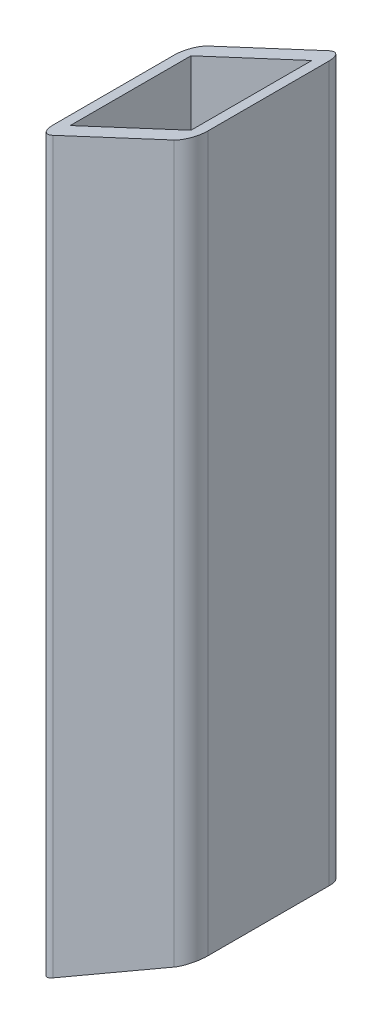
ISO-10303-21;
HEADER;
FILE_DESCRIPTION(('STEP AP214'),'2;1');
FILE_NAME('part.step','',(''),(''),'','','');
FILE_SCHEMA(('AUTOMOTIVE_DESIGN { 1 0 10303 214 1 1 1 1 }'));
ENDSEC;
DATA;
#1=APPLICATION_CONTEXT('core data for automotive mechanical design processes');
#2=APPLICATION_PROTOCOL_DEFINITION('international standard','automotive_design',2000,#1);
#3=PRODUCT_CONTEXT('',#1,'mechanical');
#4=PRODUCT('Part','Part','',(#3));
#5=PRODUCT_RELATED_PRODUCT_CATEGORY('part','',(#4));
#6=PRODUCT_DEFINITION_FORMATION('','',#4);
#7=PRODUCT_DEFINITION_CONTEXT('part definition',#1,'design');
#8=PRODUCT_DEFINITION('design','',#6,#7);
#9=PRODUCT_DEFINITION_SHAPE('','',#8);
#10=(LENGTH_UNIT() NAMED_UNIT(*) SI_UNIT(.MILLI.,.METRE.));
#11=(NAMED_UNIT(*) PLANE_ANGLE_UNIT() SI_UNIT($,.RADIAN.));
#12=(NAMED_UNIT(*) SI_UNIT($,.STERADIAN.) SOLID_ANGLE_UNIT());
#13=UNCERTAINTY_MEASURE_WITH_UNIT(LENGTH_MEASURE(1.E-05),#10,'distance_accuracy_value','');
#14=(GEOMETRIC_REPRESENTATION_CONTEXT(3) GLOBAL_UNCERTAINTY_ASSIGNED_CONTEXT((#13)) GLOBAL_UNIT_ASSIGNED_CONTEXT((#10,
#11,#12)) REPRESENTATION_CONTEXT('',''));
#15=CARTESIAN_POINT('',(0.,0.,0.));
#16=DIRECTION('',(0.,0.,1.));
#17=DIRECTION('',(1.,0.,0.));
#18=AXIS2_PLACEMENT_3D('',#15,#16,#17);
#19=CARTESIAN_POINT('',(22.8,133.,2.8));
#20=DIRECTION('',(0.,-1.,0.));
#21=DIRECTION('',(0.,0.,-1.));
#22=AXIS2_PLACEMENT_3D('',#19,#20,#21);
#23=CYLINDRICAL_SURFACE('',#22,2.8);
#24=CARTESIAN_POINT('',(22.8,13.1635861375233,2.8));
#25=DIRECTION('',(0.499999999999995,-0.866025403784442,0.));
#26=DIRECTION('',(-0.866025403784442,-0.499999999999995,0.));
#27=AXIS2_PLACEMENT_3D('',#24,#25,#26);
#28=ELLIPSE('',#27,3.23316150746189,2.8);
#29=CARTESIAN_POINT('',(22.8,13.1635861375233,0.));
#30=VERTEX_POINT('',#29);
#31=CARTESIAN_POINT('',(25.6,14.7801668912542,2.80000000000002));
#32=VERTEX_POINT('',#31);
#33=EDGE_CURVE('E172',#30,#32,#28,.T.);
#34=ORIENTED_EDGE('',*,*,#33,.F.);
#35=DIRECTION('',(0.,-1.,0.));
#36=VECTOR('',#35,1.);
#37=CARTESIAN_POINT('',(22.8,133.,0.));
#38=LINE('',#37,#36);
#39=CARTESIAN_POINT('',(22.8,131.694338557166,0.));
#40=VERTEX_POINT('',#39);
#41=EDGE_CURVE('E43',#40,#30,#38,.T.);
#42=ORIENTED_EDGE('',*,*,#41,.F.);
#43=CARTESIAN_POINT('',(22.8,131.694338557166,2.8));
#44=DIRECTION('',(-0.422618261740701,0.906307787036649,0.));
#45=DIRECTION('',(-0.906307787036649,-0.422618261740701,0.));
#46=AXIS2_PLACEMENT_3D('',#43,#44,#45);
#47=ELLIPSE('',#46,3.08945817309498,2.8);
#48=CARTESIAN_POINT('',(25.6,133.,2.8));
#49=VERTEX_POINT('',#48);
#50=EDGE_CURVE('E170',#49,#40,#47,.T.);
#51=ORIENTED_EDGE('',*,*,#50,.F.);
#52=DIRECTION('',(0.,-1.,0.));
#53=VECTOR('',#52,1.);
#54=CARTESIAN_POINT('',(25.6,133.,2.80000000000002));
#55=LINE('',#54,#53);
#56=EDGE_CURVE('E189',#49,#32,#55,.T.);
#57=ORIENTED_EDGE('',*,*,#56,.T.);
#58=EDGE_LOOP('',(#34,#42,#51,#57));
#59=FACE_BOUND('',#58,.T.);
#60=ADVANCED_FACE('F36',(#59),#23,.T.);
#61=CARTESIAN_POINT('',(2.80000000000002,133.,0.));
#62=DIRECTION('',(0.,0.,1.));
#63=DIRECTION('',(1.,0.,0.));
#64=AXIS2_PLACEMENT_3D('',#61,#62,#63);
#65=PLANE('',#64);
#66=DIRECTION('',(0.866025403784442,0.499999999999995,0.));
#67=VECTOR('',#66,1.);
#68=CARTESIAN_POINT('',(59.6906893516648,34.4624355652975,0.));
#69=LINE('',#68,#67);
#70=CARTESIAN_POINT('',(2.80000000000002,1.61658075373092,0.));
#71=VERTEX_POINT('',#70);
#72=EDGE_CURVE('E148',#71,#30,#69,.T.);
#73=ORIENTED_EDGE('',*,*,#72,.F.);
#74=DIRECTION('',(0.,-1.,0.));
#75=VECTOR('',#74,1.);
#76=CARTESIAN_POINT('',(2.80000000000002,133.,0.));
#77=LINE('',#76,#75);
#78=CARTESIAN_POINT('',(2.80000000000002,122.368185394066,0.));
#79=VERTEX_POINT('',#78);
#80=EDGE_CURVE('E147',#79,#71,#77,.T.);
#81=ORIENTED_EDGE('',*,*,#80,.F.);
#82=DIRECTION('',(-0.906307787036649,-0.422618261740701,0.));
#83=VECTOR('',#82,1.);
#84=CARTESIAN_POINT('',(6.87222124957349,124.267093348444,0.));
#85=LINE('',#84,#83);
#86=EDGE_CURVE('E164',#40,#79,#85,.T.);
#87=ORIENTED_EDGE('',*,*,#86,.F.);
#88=ORIENTED_EDGE('',*,*,#41,.T.);
#89=EDGE_LOOP('',(#73,#81,#87,#88));
#90=FACE_BOUND('',#89,.T.);
#91=ADVANCED_FACE('F162',(#90),#65,.F.);
#92=CARTESIAN_POINT('',(2.8,133.,2.8));
#93=DIRECTION('',(0.,-1.,0.));
#94=DIRECTION('',(0.,0.,-1.));
#95=AXIS2_PLACEMENT_3D('',#92,#93,#94);
#96=CYLINDRICAL_SURFACE('',#95,2.8);
#97=CARTESIAN_POINT('',(2.8,1.61658075373092,2.8));
#98=DIRECTION('',(0.499999999999995,-0.866025403784442,0.));
#99=DIRECTION('',(-0.866025403784442,-0.499999999999995,0.));
#100=AXIS2_PLACEMENT_3D('',#97,#98,#99);
#101=ELLIPSE('',#100,3.23316150746189,2.8);
#102=CARTESIAN_POINT('',(0.,0.,2.80000000000002));
#103=VERTEX_POINT('',#102);
#104=EDGE_CURVE('E129',#103,#71,#101,.T.);
#105=ORIENTED_EDGE('',*,*,#104,.F.);
#106=DIRECTION('',(0.,-1.,0.));
#107=VECTOR('',#106,1.);
#108=CARTESIAN_POINT('',(0.,133.,2.80000000000002));
#109=LINE('',#108,#107);
#110=CARTESIAN_POINT('',(0.,121.062523951232,2.80000000000002));
#111=VERTEX_POINT('',#110);
#112=EDGE_CURVE('E144',#111,#103,#109,.T.);
#113=ORIENTED_EDGE('',*,*,#112,.F.);
#114=CARTESIAN_POINT('',(2.8,122.368185394066,2.8));
#115=DIRECTION('',(-0.422618261740701,0.906307787036649,0.));
#116=DIRECTION('',(-0.906307787036649,-0.422618261740701,0.));
#117=AXIS2_PLACEMENT_3D('',#114,#115,#116);
#118=ELLIPSE('',#117,3.08945817309498,2.8);
#119=EDGE_CURVE('E181',#79,#111,#118,.T.);
#120=ORIENTED_EDGE('',*,*,#119,.F.);
#121=ORIENTED_EDGE('',*,*,#80,.T.);
#122=EDGE_LOOP('',(#105,#113,#120,#121));
#123=FACE_BOUND('',#122,.T.);
#124=ADVANCED_FACE('F143',(#123),#96,.T.);
#125=CARTESIAN_POINT('',(2.8,133.,22.8));
#126=DIRECTION('',(0.,-1.,0.));
#127=DIRECTION('',(0.,0.,-1.));
#128=AXIS2_PLACEMENT_3D('',#125,#126,#127);
#129=CYLINDRICAL_SURFACE('',#128,2.8);
#130=CARTESIAN_POINT('',(2.8,1.61658075373092,22.8));
#131=DIRECTION('',(0.499999999999995,-0.866025403784442,0.));
#132=DIRECTION('',(-0.866025403784442,-0.499999999999995,0.));
#133=AXIS2_PLACEMENT_3D('',#130,#131,#132);
#134=ELLIPSE('',#133,3.23316150746189,2.8);
#135=CARTESIAN_POINT('',(2.80000000000002,1.61658075373094,25.6));
#136=VERTEX_POINT('',#135);
#137=CARTESIAN_POINT('',(0.,0.,22.8));
#138=VERTEX_POINT('',#137);
#139=EDGE_CURVE('E132',#136,#138,#134,.T.);
#140=ORIENTED_EDGE('',*,*,#139,.F.);
#141=DIRECTION('',(0.,-1.,0.));
#142=VECTOR('',#141,1.);
#143=CARTESIAN_POINT('',(2.80000000000002,133.,25.6));
#144=LINE('',#143,#142);
#145=CARTESIAN_POINT('',(2.80000000000002,122.368185394066,25.6));
#146=VERTEX_POINT('',#145);
#147=EDGE_CURVE('E156',#146,#136,#144,.T.);
#148=ORIENTED_EDGE('',*,*,#147,.F.);
#149=CARTESIAN_POINT('',(2.8,122.368185394066,22.8));
#150=DIRECTION('',(-0.422618261740701,0.906307787036649,0.));
#151=DIRECTION('',(-0.906307787036649,-0.422618261740701,0.));
#152=AXIS2_PLACEMENT_3D('',#149,#150,#151);
#153=ELLIPSE('',#152,3.08945817309498,2.8);
#154=CARTESIAN_POINT('',(0.,121.062523951232,22.8));
#155=VERTEX_POINT('',#154);
#156=EDGE_CURVE('E209',#155,#146,#153,.T.);
#157=ORIENTED_EDGE('',*,*,#156,.F.);
#158=DIRECTION('',(0.,-1.,0.));
#159=VECTOR('',#158,1.);
#160=CARTESIAN_POINT('',(0.,133.,22.8));
#161=LINE('',#160,#159);
#162=EDGE_CURVE('E153',#155,#138,#161,.T.);
#163=ORIENTED_EDGE('',*,*,#162,.T.);
#164=EDGE_LOOP('',(#140,#148,#157,#163));
#165=FACE_BOUND('',#164,.T.);
#166=ADVANCED_FACE('F208',(#165),#129,.T.);
#167=CARTESIAN_POINT('',(2.80000000000002,133.,25.6));
#168=DIRECTION('',(0.,0.,-1.));
#169=DIRECTION('',(-1.,0.,0.));
#170=AXIS2_PLACEMENT_3D('',#167,#168,#169);
#171=PLANE('',#170);
#172=DIRECTION('',(-0.866025403784442,-0.499999999999995,0.));
#173=VECTOR('',#172,1.);
#174=CARTESIAN_POINT('',(59.6906893516648,34.4624355652975,25.6));
#175=LINE('',#174,#173);
#176=CARTESIAN_POINT('',(22.8,13.1635861375232,25.6));
#177=VERTEX_POINT('',#176);
#178=EDGE_CURVE('E203',#177,#136,#175,.T.);
#179=ORIENTED_EDGE('',*,*,#178,.F.);
#180=DIRECTION('',(0.,-1.,0.));
#181=VECTOR('',#180,1.);
#182=CARTESIAN_POINT('',(22.8,133.,25.6));
#183=LINE('',#182,#181);
#184=CARTESIAN_POINT('',(22.8,131.694338557166,25.6));
#185=VERTEX_POINT('',#184);
#186=EDGE_CURVE('E195',#185,#177,#183,.T.);
#187=ORIENTED_EDGE('',*,*,#186,.F.);
#188=DIRECTION('',(0.906307787036649,0.422618261740701,0.));
#189=VECTOR('',#188,1.);
#190=CARTESIAN_POINT('',(6.87222124957349,124.267093348444,25.6));
#191=LINE('',#190,#189);
#192=EDGE_CURVE('E205',#146,#185,#191,.T.);
#193=ORIENTED_EDGE('',*,*,#192,.F.);
#194=ORIENTED_EDGE('',*,*,#147,.T.);
#195=EDGE_LOOP('',(#179,#187,#193,#194));
#196=FACE_BOUND('',#195,.T.);
#197=ADVANCED_FACE('F201',(#196),#171,.F.);
#198=CARTESIAN_POINT('',(22.8,133.,22.8));
#199=DIRECTION('',(0.,-1.,0.));
#200=DIRECTION('',(0.,0.,-1.));
#201=AXIS2_PLACEMENT_3D('',#198,#199,#200);
#202=CYLINDRICAL_SURFACE('',#201,2.8);
#203=CARTESIAN_POINT('',(22.8,13.1635861375233,22.8));
#204=DIRECTION('',(0.499999999999995,-0.866025403784442,0.));
#205=DIRECTION('',(-0.866025403784442,-0.499999999999995,0.));
#206=AXIS2_PLACEMENT_3D('',#203,#204,#205);
#207=ELLIPSE('',#206,3.23316150746189,2.8);
#208=CARTESIAN_POINT('',(25.6,14.7801668912542,22.8));
#209=VERTEX_POINT('',#208);
#210=EDGE_CURVE('E229',#209,#177,#207,.T.);
#211=ORIENTED_EDGE('',*,*,#210,.F.);
#212=DIRECTION('',(0.,-1.,0.));
#213=VECTOR('',#212,1.);
#214=CARTESIAN_POINT('',(25.6,133.,22.8));
#215=LINE('',#214,#213);
#216=CARTESIAN_POINT('',(25.6,133.,22.8));
#217=VERTEX_POINT('',#216);
#218=EDGE_CURVE('E192',#217,#209,#215,.T.);
#219=ORIENTED_EDGE('',*,*,#218,.F.);
#220=CARTESIAN_POINT('',(22.8,131.694338557166,22.8));
#221=DIRECTION('',(-0.422618261740701,0.906307787036649,0.));
#222=DIRECTION('',(-0.906307787036649,-0.422618261740701,0.));
#223=AXIS2_PLACEMENT_3D('',#220,#221,#222);
#224=ELLIPSE('',#223,3.08945817309498,2.8);
#225=EDGE_CURVE('E211',#185,#217,#224,.T.);
#226=ORIENTED_EDGE('',*,*,#225,.F.);
#227=ORIENTED_EDGE('',*,*,#186,.T.);
#228=EDGE_LOOP('',(#211,#219,#226,#227));
#229=FACE_BOUND('',#228,.T.);
#230=ADVANCED_FACE('F244',(#229),#202,.T.);
#231=CARTESIAN_POINT('',(22.8,1040.5,2.8));
#232=DIRECTION('',(1.,0.,0.));
#233=DIRECTION('',(0.,0.,-1.));
#234=AXIS2_PLACEMENT_3D('',#231,#232,#233);
#235=PLANE('',#234);
#236=DIRECTION('',(0.,0.,-1.));
#237=VECTOR('',#236,1.);
#238=CARTESIAN_POINT('',(22.8,13.1635861375232,2.7999999999999));
#239=LINE('',#238,#237);
#240=CARTESIAN_POINT('',(22.8,13.1635861375232,22.8));
#241=VERTEX_POINT('',#240);
#242=CARTESIAN_POINT('',(22.8,13.1635861375233,2.8));
#243=VERTEX_POINT('',#242);
#244=EDGE_CURVE('E231',#241,#243,#239,.T.);
#245=ORIENTED_EDGE('',*,*,#244,.F.);
#246=DIRECTION('',(0.,-1.,0.));
#247=VECTOR('',#246,1.);
#248=CARTESIAN_POINT('',(22.8,1040.5,22.8));
#249=LINE('',#248,#247);
#250=CARTESIAN_POINT('',(22.8,131.694338557166,22.8));
#251=VERTEX_POINT('',#250);
#252=EDGE_CURVE('E177',#251,#241,#249,.T.);
#253=ORIENTED_EDGE('',*,*,#252,.F.);
#254=DIRECTION('',(0.,0.,1.));
#255=VECTOR('',#254,1.);
#256=CARTESIAN_POINT('',(22.8,131.694338557166,2.79999999999992));
#257=LINE('',#256,#255);
#258=CARTESIAN_POINT('',(22.8,131.694338557166,2.8));
#259=VERTEX_POINT('',#258);
#260=EDGE_CURVE('E215',#259,#251,#257,.T.);
#261=ORIENTED_EDGE('',*,*,#260,.F.);
#262=DIRECTION('',(0.,-1.,0.));
#263=VECTOR('',#262,1.);
#264=CARTESIAN_POINT('',(22.8,1040.5,2.8));
#265=LINE('',#264,#263);
#266=EDGE_CURVE('E138',#259,#243,#265,.T.);
#267=ORIENTED_EDGE('',*,*,#266,.T.);
#268=EDGE_LOOP('',(#245,#253,#261,#267));
#269=FACE_BOUND('',#268,.T.);
#270=ADVANCED_FACE('F272',(#269),#235,.F.);
#271=CARTESIAN_POINT('',(2.8,1040.5,2.8));
#272=DIRECTION('',(0.,0.,-1.));
#273=DIRECTION('',(-1.,0.,0.));
#274=AXIS2_PLACEMENT_3D('',#271,#272,#273);
#275=PLANE('',#274);
#276=DIRECTION('',(-0.866025403784442,-0.499999999999995,0.));
#277=VECTOR('',#276,1.);
#278=CARTESIAN_POINT('',(452.649716318851,261.337435565292,2.80000000000006));
#279=LINE('',#278,#277);
#280=CARTESIAN_POINT('',(2.8,1.61658075373095,2.8));
#281=VERTEX_POINT('',#280);
#282=EDGE_CURVE('E50',#243,#281,#279,.T.);
#283=ORIENTED_EDGE('',*,*,#282,.F.);
#284=ORIENTED_EDGE('',*,*,#266,.F.);
#285=DIRECTION('',(0.906307787036649,0.422618261740701,0.));
#286=VECTOR('',#285,1.);
#287=CARTESIAN_POINT('',(354.464887314811,286.352215453177,2.80000000000005));
#288=LINE('',#287,#286);
#289=CARTESIAN_POINT('',(2.8,122.368185394066,2.8));
#290=VERTEX_POINT('',#289);
#291=EDGE_CURVE('E218',#290,#259,#288,.T.);
#292=ORIENTED_EDGE('',*,*,#291,.F.);
#293=DIRECTION('',(0.,-1.,0.));
#294=VECTOR('',#293,1.);
#295=CARTESIAN_POINT('',(2.8,1040.5,2.8));
#296=LINE('',#295,#294);
#297=EDGE_CURVE('E186',#290,#281,#296,.T.);
#298=ORIENTED_EDGE('',*,*,#297,.T.);
#299=EDGE_LOOP('',(#283,#284,#292,#298));
#300=FACE_BOUND('',#299,.T.);
#301=ADVANCED_FACE('F276',(#300),#275,.F.);
#302=CARTESIAN_POINT('',(2.8,1040.5,2.8));
#303=DIRECTION('',(-1.,0.,0.));
#304=DIRECTION('',(0.,0.,1.));
#305=AXIS2_PLACEMENT_3D('',#302,#303,#304);
#306=PLANE('',#305);
#307=DIRECTION('',(0.,0.,1.));
#308=VECTOR('',#307,1.);
#309=CARTESIAN_POINT('',(2.8,1.61658075373095,2.7999999999999));
#310=LINE('',#309,#308);
#311=CARTESIAN_POINT('',(2.79999999999998,1.61658075373097,22.8));
#312=VERTEX_POINT('',#311);
#313=EDGE_CURVE('E58',#281,#312,#310,.T.);
#314=ORIENTED_EDGE('',*,*,#313,.F.);
#315=ORIENTED_EDGE('',*,*,#297,.F.);
#316=DIRECTION('',(0.,0.,-1.));
#317=VECTOR('',#316,1.);
#318=CARTESIAN_POINT('',(2.8,122.368185394066,2.79999999999993));
#319=LINE('',#318,#317);
#320=CARTESIAN_POINT('',(2.80000000000002,122.368185394066,22.8));
#321=VERTEX_POINT('',#320);
#322=EDGE_CURVE('E221',#321,#290,#319,.T.);
#323=ORIENTED_EDGE('',*,*,#322,.F.);
#324=DIRECTION('',(0.,-1.,0.));
#325=VECTOR('',#324,1.);
#326=CARTESIAN_POINT('',(2.8,1040.5,22.8));
#327=LINE('',#326,#325);
#328=EDGE_CURVE('E179',#321,#312,#327,.T.);
#329=ORIENTED_EDGE('',*,*,#328,.T.);
#330=EDGE_LOOP('',(#314,#315,#323,#329));
#331=FACE_BOUND('',#330,.T.);
#332=ADVANCED_FACE('F254',(#331),#306,.F.);
#333=CARTESIAN_POINT('',(2.8,1040.5,22.8));
#334=DIRECTION('',(0.,0.,1.));
#335=DIRECTION('',(1.,0.,0.));
#336=AXIS2_PLACEMENT_3D('',#333,#334,#335);
#337=PLANE('',#336);
#338=DIRECTION('',(0.866025403784442,0.499999999999995,0.));
#339=VECTOR('',#338,1.);
#340=CARTESIAN_POINT('',(452.649716318851,261.337435565292,22.8000000000001));
#341=LINE('',#340,#339);
#342=EDGE_CURVE('E236',#312,#241,#341,.T.);
#343=ORIENTED_EDGE('',*,*,#342,.F.);
#344=ORIENTED_EDGE('',*,*,#328,.F.);
#345=DIRECTION('',(-0.906307787036649,-0.422618261740701,0.));
#346=VECTOR('',#345,1.);
#347=CARTESIAN_POINT('',(354.464887314811,286.352215453177,22.8000000000001));
#348=LINE('',#347,#346);
#349=EDGE_CURVE('E11',#251,#321,#348,.T.);
#350=ORIENTED_EDGE('',*,*,#349,.F.);
#351=ORIENTED_EDGE('',*,*,#252,.T.);
#352=EDGE_LOOP('',(#343,#344,#350,#351));
#353=FACE_BOUND('',#352,.T.);
#354=ADVANCED_FACE('F247',(#353),#337,.F.);
#355=CARTESIAN_POINT('',(25.6,133.,2.80000000000002));
#356=DIRECTION('',(-1.,0.,0.));
#357=DIRECTION('',(0.,0.,1.));
#358=AXIS2_PLACEMENT_3D('',#355,#356,#357);
#359=PLANE('',#358);
#360=DIRECTION('',(0.,0.,1.));
#361=VECTOR('',#360,1.);
#362=CARTESIAN_POINT('',(25.6,14.7801668912542,-174.499339813013));
#363=LINE('',#362,#361);
#364=EDGE_CURVE('E239',#32,#209,#363,.T.);
#365=ORIENTED_EDGE('',*,*,#364,.F.);
#366=ORIENTED_EDGE('',*,*,#56,.F.);
#367=DIRECTION('',(0.,0.,-1.));
#368=VECTOR('',#367,1.);
#369=CARTESIAN_POINT('',(25.6,133.,2.80000000000002));
#370=LINE('',#369,#368);
#371=EDGE_CURVE('E137',#217,#49,#370,.T.);
#372=ORIENTED_EDGE('',*,*,#371,.F.);
#373=ORIENTED_EDGE('',*,*,#218,.T.);
#374=EDGE_LOOP('',(#365,#366,#372,#373));
#375=FACE_BOUND('',#374,.T.);
#376=ADVANCED_FACE('F245',(#375),#359,.F.);
#377=CARTESIAN_POINT('',(0.,133.,2.80000000000002));
#378=DIRECTION('',(1.,0.,0.));
#379=DIRECTION('',(0.,0.,-1.));
#380=AXIS2_PLACEMENT_3D('',#377,#378,#379);
#381=PLANE('',#380);
#382=DIRECTION('',(0.,0.,1.));
#383=VECTOR('',#382,1.);
#384=CARTESIAN_POINT('',(0.,121.062523951232,-177.999339813013));
#385=LINE('',#384,#383);
#386=EDGE_CURVE('E152',#111,#155,#385,.T.);
#387=ORIENTED_EDGE('',*,*,#386,.F.);
#388=ORIENTED_EDGE('',*,*,#112,.T.);
#389=DIRECTION('',(0.,0.,1.));
#390=VECTOR('',#389,1.);
#391=CARTESIAN_POINT('',(0.,0.,2.80000000000002));
#392=LINE('',#391,#390);
#393=EDGE_CURVE('E126',#103,#138,#392,.T.);
#394=ORIENTED_EDGE('',*,*,#393,.T.);
#395=ORIENTED_EDGE('',*,*,#162,.F.);
#396=EDGE_LOOP('',(#387,#388,#394,#395));
#397=FACE_BOUND('',#396,.T.);
#398=ADVANCED_FACE('F150',(#397),#381,.F.);
#399=CARTESIAN_POINT('',(25.6,133.,-177.999339813013));
#400=DIRECTION('',(-0.422618261740701,0.906307787036649,0.));
#401=DIRECTION('',(-0.906307787036649,-0.422618261740701,0.));
#402=AXIS2_PLACEMENT_3D('',#399,#400,#401);
#403=PLANE('',#402);
#404=ORIENTED_EDGE('',*,*,#291,.T.);
#405=ORIENTED_EDGE('',*,*,#260,.T.);
#406=ORIENTED_EDGE('',*,*,#349,.T.);
#407=ORIENTED_EDGE('',*,*,#322,.T.);
#408=EDGE_LOOP('',(#404,#405,#406,#407));
#409=FACE_BOUND('',#408,.T.);
#410=ORIENTED_EDGE('',*,*,#371,.T.);
#411=ORIENTED_EDGE('',*,*,#50,.T.);
#412=ORIENTED_EDGE('',*,*,#86,.T.);
#413=ORIENTED_EDGE('',*,*,#119,.T.);
#414=ORIENTED_EDGE('',*,*,#386,.T.);
#415=ORIENTED_EDGE('',*,*,#156,.T.);
#416=ORIENTED_EDGE('',*,*,#192,.T.);
#417=ORIENTED_EDGE('',*,*,#225,.T.);
#418=EDGE_LOOP('',(#410,#411,#412,#413,#414,#415,#416,#417));
#419=FACE_BOUND('',#418,.T.);
#420=ADVANCED_FACE('F174',(#409,#419),#403,.T.);
#421=CARTESIAN_POINT('',(0.,0.,-174.499339813013));
#422=DIRECTION('',(0.499999999999995,-0.866025403784442,0.));
#423=DIRECTION('',(0.866025403784442,0.499999999999995,0.));
#424=AXIS2_PLACEMENT_3D('',#421,#422,#423);
#425=PLANE('',#424);
#426=ORIENTED_EDGE('',*,*,#342,.T.);
#427=ORIENTED_EDGE('',*,*,#244,.T.);
#428=ORIENTED_EDGE('',*,*,#282,.T.);
#429=ORIENTED_EDGE('',*,*,#313,.T.);
#430=EDGE_LOOP('',(#426,#427,#428,#429));
#431=FACE_BOUND('',#430,.T.);
#432=ORIENTED_EDGE('',*,*,#72,.T.);
#433=ORIENTED_EDGE('',*,*,#33,.T.);
#434=ORIENTED_EDGE('',*,*,#364,.T.);
#435=ORIENTED_EDGE('',*,*,#210,.T.);
#436=ORIENTED_EDGE('',*,*,#178,.T.);
#437=ORIENTED_EDGE('',*,*,#139,.T.);
#438=ORIENTED_EDGE('',*,*,#393,.F.);
#439=ORIENTED_EDGE('',*,*,#104,.T.);
#440=EDGE_LOOP('',(#432,#433,#434,#435,#436,#437,#438,#439));
#441=FACE_BOUND('',#440,.T.);
#442=ADVANCED_FACE('F128',(#431,#441),#425,.T.);
#443=CLOSED_SHELL('',(#60,#91,#124,#166,#197,#230,#270,#301,#332,#354,#376,#398,#420,#442));
#444=MANIFOLD_SOLID_BREP('B2',#443);
#445=ADVANCED_BREP_SHAPE_REPRESENTATION('',(#18,#444),#14);
#446=SHAPE_DEFINITION_REPRESENTATION(#9,#445);
ENDSEC;
END-ISO-10303-21;
